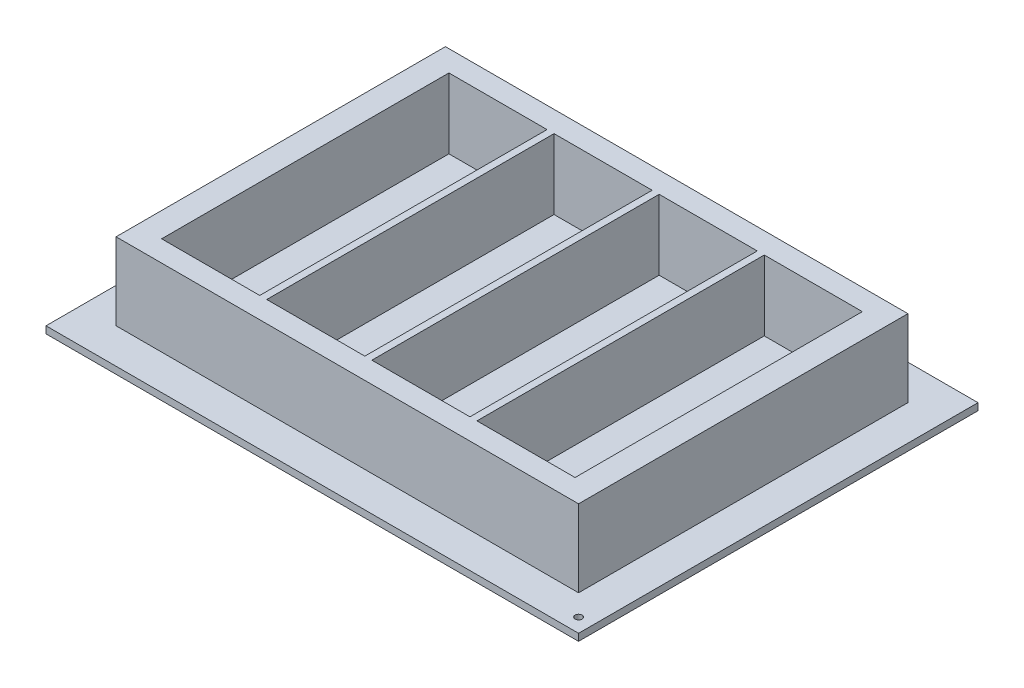
ISO-10303-21;
HEADER;
FILE_DESCRIPTION(('STEP AP214'),'2;1');
FILE_NAME('part.step','',(''),(''),'','','');
FILE_SCHEMA(('AUTOMOTIVE_DESIGN { 1 0 10303 214 1 1 1 1 }'));
ENDSEC;
DATA;
#1=APPLICATION_CONTEXT('core data for automotive mechanical design processes');
#2=APPLICATION_PROTOCOL_DEFINITION('international standard','automotive_design',2000,#1);
#3=PRODUCT_CONTEXT('',#1,'mechanical');
#4=PRODUCT('Part','Part','',(#3));
#5=PRODUCT_RELATED_PRODUCT_CATEGORY('part','',(#4));
#6=PRODUCT_DEFINITION_FORMATION('','',#4);
#7=PRODUCT_DEFINITION_CONTEXT('part definition',#1,'design');
#8=PRODUCT_DEFINITION('design','',#6,#7);
#9=PRODUCT_DEFINITION_SHAPE('','',#8);
#10=(LENGTH_UNIT() NAMED_UNIT(*) SI_UNIT(.MILLI.,.METRE.));
#11=(NAMED_UNIT(*) PLANE_ANGLE_UNIT() SI_UNIT($,.RADIAN.));
#12=(NAMED_UNIT(*) SI_UNIT($,.STERADIAN.) SOLID_ANGLE_UNIT());
#13=UNCERTAINTY_MEASURE_WITH_UNIT(LENGTH_MEASURE(1.E-05),#10,'distance_accuracy_value','');
#14=(GEOMETRIC_REPRESENTATION_CONTEXT(3) GLOBAL_UNCERTAINTY_ASSIGNED_CONTEXT((#13)) GLOBAL_UNIT_ASSIGNED_CONTEXT((#10,
#11,#12)) REPRESENTATION_CONTEXT('',''));
#15=CARTESIAN_POINT('',(0.,0.,0.));
#16=DIRECTION('',(0.,0.,1.));
#17=DIRECTION('',(1.,0.,0.));
#18=AXIS2_PLACEMENT_3D('',#15,#16,#17);
#19=CARTESIAN_POINT('',(-29.5,10.,-20.5));
#20=DIRECTION('',(0.,0.,1.));
#21=DIRECTION('',(1.,0.,0.));
#22=AXIS2_PLACEMENT_3D('',#19,#20,#21);
#23=PLANE('',#22);
#24=DIRECTION('',(-1.,0.,0.));
#25=VECTOR('',#24,1.);
#26=CARTESIAN_POINT('',(-29.5,10.,-20.5));
#27=LINE('',#26,#25);
#28=CARTESIAN_POINT('',(29.5,10.,-20.5));
#29=VERTEX_POINT('',#28);
#30=CARTESIAN_POINT('',(15.5,10.,-20.5));
#31=VERTEX_POINT('',#30);
#32=EDGE_CURVE('E311',#29,#31,#27,.T.);
#33=ORIENTED_EDGE('',*,*,#32,.T.);
#34=DIRECTION('',(0.,1.,0.));
#35=VECTOR('',#34,1.);
#36=CARTESIAN_POINT('',(15.5,0.,-20.5));
#37=LINE('',#36,#35);
#38=CARTESIAN_POINT('',(15.5,0.,-20.5));
#39=VERTEX_POINT('',#38);
#40=EDGE_CURVE('E64',#39,#31,#37,.T.);
#41=ORIENTED_EDGE('',*,*,#40,.F.);
#42=DIRECTION('',(-1.,0.,0.));
#43=VECTOR('',#42,1.);
#44=CARTESIAN_POINT('',(-29.5,0.,-20.5));
#45=LINE('',#44,#43);
#46=CARTESIAN_POINT('',(29.5,0.,-20.5));
#47=VERTEX_POINT('',#46);
#48=EDGE_CURVE('E326',#47,#39,#45,.T.);
#49=ORIENTED_EDGE('',*,*,#48,.F.);
#50=DIRECTION('',(0.,-1.,0.));
#51=VECTOR('',#50,1.);
#52=CARTESIAN_POINT('',(29.5,10.,-20.5));
#53=LINE('',#52,#51);
#54=EDGE_CURVE('E343',#29,#47,#53,.T.);
#55=ORIENTED_EDGE('',*,*,#54,.F.);
#56=EDGE_LOOP('',(#33,#41,#49,#55));
#57=FACE_BOUND('',#56,.T.);
#58=ADVANCED_FACE('F41',(#57),#23,.T.);
#59=CARTESIAN_POINT('',(-29.5,10.,20.5));
#60=DIRECTION('',(0.,0.,-1.));
#61=DIRECTION('',(-1.,0.,0.));
#62=AXIS2_PLACEMENT_3D('',#59,#60,#61);
#63=PLANE('',#62);
#64=DIRECTION('',(1.,0.,0.));
#65=VECTOR('',#64,1.);
#66=CARTESIAN_POINT('',(-29.5,0.,20.5));
#67=LINE('',#66,#65);
#68=CARTESIAN_POINT('',(15.5,0.,20.5));
#69=VERTEX_POINT('',#68);
#70=CARTESIAN_POINT('',(29.5,0.,20.5));
#71=VERTEX_POINT('',#70);
#72=EDGE_CURVE('E332',#69,#71,#67,.T.);
#73=ORIENTED_EDGE('',*,*,#72,.F.);
#74=DIRECTION('',(0.,1.,0.));
#75=VECTOR('',#74,1.);
#76=CARTESIAN_POINT('',(15.5,0.,20.5));
#77=LINE('',#76,#75);
#78=CARTESIAN_POINT('',(15.5,10.,20.5));
#79=VERTEX_POINT('',#78);
#80=EDGE_CURVE('E242',#69,#79,#77,.T.);
#81=ORIENTED_EDGE('',*,*,#80,.T.);
#82=DIRECTION('',(1.,0.,0.));
#83=VECTOR('',#82,1.);
#84=CARTESIAN_POINT('',(-29.5,10.,20.5));
#85=LINE('',#84,#83);
#86=CARTESIAN_POINT('',(29.5,10.,20.5));
#87=VERTEX_POINT('',#86);
#88=EDGE_CURVE('E317',#79,#87,#85,.T.);
#89=ORIENTED_EDGE('',*,*,#88,.T.);
#90=DIRECTION('',(0.,-1.,0.));
#91=VECTOR('',#90,1.);
#92=CARTESIAN_POINT('',(29.5,10.,20.5));
#93=LINE('',#92,#91);
#94=EDGE_CURVE('E321',#87,#71,#93,.T.);
#95=ORIENTED_EDGE('',*,*,#94,.T.);
#96=EDGE_LOOP('',(#73,#81,#89,#95));
#97=FACE_BOUND('',#96,.T.);
#98=ADVANCED_FACE('F390',(#97),#63,.T.);
#99=CARTESIAN_POINT('',(0.,0.,0.));
#100=DIRECTION('',(0.,-1.,0.));
#101=DIRECTION('',(0.,0.,-1.));
#102=AXIS2_PLACEMENT_3D('',#99,#100,#101);
#103=PLANE('',#102);
#104=DIRECTION('',(0.,0.,1.));
#105=VECTOR('',#104,1.);
#106=CARTESIAN_POINT('',(15.5,0.,0.));
#107=LINE('',#106,#105);
#108=EDGE_CURVE('E237',#39,#69,#107,.T.);
#109=ORIENTED_EDGE('',*,*,#108,.T.);
#110=ORIENTED_EDGE('',*,*,#72,.T.);
#111=DIRECTION('',(0.,0.,-1.));
#112=VECTOR('',#111,1.);
#113=CARTESIAN_POINT('',(29.5,0.,-20.5));
#114=LINE('',#113,#112);
#115=EDGE_CURVE('E306',#71,#47,#114,.T.);
#116=ORIENTED_EDGE('',*,*,#115,.T.);
#117=ORIENTED_EDGE('',*,*,#48,.T.);
#118=EDGE_LOOP('',(#109,#110,#116,#117));
#119=FACE_BOUND('',#118,.T.);
#120=ADVANCED_FACE('F397',(#119),#103,.F.);
#121=DIRECTION('',(0.,1.,0.));
#122=VECTOR('',#121,1.);
#123=CARTESIAN_POINT('',(14.5,0.,-20.5));
#124=LINE('',#123,#122);
#125=CARTESIAN_POINT('',(14.5,0.,-20.5));
#126=VERTEX_POINT('',#125);
#127=CARTESIAN_POINT('',(14.5,10.,-20.5));
#128=VERTEX_POINT('',#127);
#129=EDGE_CURVE('E248',#126,#128,#124,.T.);
#130=ORIENTED_EDGE('',*,*,#129,.T.);
#131=CARTESIAN_POINT('',(0.499999999999994,10.,-20.5));
#132=VERTEX_POINT('',#131);
#133=EDGE_CURVE('E314',#128,#132,#27,.T.);
#134=ORIENTED_EDGE('',*,*,#133,.T.);
#135=DIRECTION('',(0.,1.,0.));
#136=VECTOR('',#135,1.);
#137=CARTESIAN_POINT('',(0.499999999999998,0.,-20.5));
#138=LINE('',#137,#136);
#139=CARTESIAN_POINT('',(0.499999999999994,0.,-20.5));
#140=VERTEX_POINT('',#139);
#141=EDGE_CURVE('E263',#140,#132,#138,.T.);
#142=ORIENTED_EDGE('',*,*,#141,.F.);
#143=EDGE_CURVE('E329',#126,#140,#45,.T.);
#144=ORIENTED_EDGE('',*,*,#143,.F.);
#145=EDGE_LOOP('',(#130,#134,#142,#144));
#146=FACE_BOUND('',#145,.T.);
#147=ADVANCED_FACE('F392',(#146),#23,.T.);
#148=DIRECTION('',(0.,1.,0.));
#149=VECTOR('',#148,1.);
#150=CARTESIAN_POINT('',(14.5,0.,20.5));
#151=LINE('',#150,#149);
#152=CARTESIAN_POINT('',(14.5,0.,20.5));
#153=VERTEX_POINT('',#152);
#154=CARTESIAN_POINT('',(14.5,10.,20.5));
#155=VERTEX_POINT('',#154);
#156=EDGE_CURVE('E245',#153,#155,#151,.T.);
#157=ORIENTED_EDGE('',*,*,#156,.F.);
#158=CARTESIAN_POINT('',(0.499999999999997,0.,20.5));
#159=VERTEX_POINT('',#158);
#160=EDGE_CURVE('E443',#159,#153,#67,.T.);
#161=ORIENTED_EDGE('',*,*,#160,.F.);
#162=DIRECTION('',(0.,1.,0.));
#163=VECTOR('',#162,1.);
#164=CARTESIAN_POINT('',(0.500000000000003,0.,20.5));
#165=LINE('',#164,#163);
#166=CARTESIAN_POINT('',(0.500000000000003,10.,20.5));
#167=VERTEX_POINT('',#166);
#168=EDGE_CURVE('E267',#159,#167,#165,.T.);
#169=ORIENTED_EDGE('',*,*,#168,.T.);
#170=EDGE_CURVE('E504',#167,#155,#85,.T.);
#171=ORIENTED_EDGE('',*,*,#170,.T.);
#172=EDGE_LOOP('',(#157,#161,#169,#171));
#173=FACE_BOUND('',#172,.T.);
#174=ADVANCED_FACE('F400',(#173),#63,.T.);
#175=ORIENTED_EDGE('',*,*,#160,.T.);
#176=DIRECTION('',(0.,0.,1.));
#177=VECTOR('',#176,1.);
#178=CARTESIAN_POINT('',(14.5,0.,0.));
#179=LINE('',#178,#177);
#180=EDGE_CURVE('E56',#126,#153,#179,.T.);
#181=ORIENTED_EDGE('',*,*,#180,.F.);
#182=ORIENTED_EDGE('',*,*,#143,.T.);
#183=DIRECTION('',(0.,0.,1.));
#184=VECTOR('',#183,1.);
#185=CARTESIAN_POINT('',(0.5,0.,0.));
#186=LINE('',#185,#184);
#187=EDGE_CURVE('E255',#140,#159,#186,.T.);
#188=ORIENTED_EDGE('',*,*,#187,.T.);
#189=EDGE_LOOP('',(#175,#181,#182,#188));
#190=FACE_BOUND('',#189,.T.);
#191=ADVANCED_FACE('F419',(#190),#103,.F.);
#192=DIRECTION('',(0.,1.,0.));
#193=VECTOR('',#192,1.);
#194=CARTESIAN_POINT('',(-0.500000000000002,0.,-20.5));
#195=LINE('',#194,#193);
#196=CARTESIAN_POINT('',(-0.500000000000007,0.,-20.5));
#197=VERTEX_POINT('',#196);
#198=CARTESIAN_POINT('',(-0.500000000000007,10.,-20.5));
#199=VERTEX_POINT('',#198);
#200=EDGE_CURVE('E258',#197,#199,#195,.T.);
#201=ORIENTED_EDGE('',*,*,#200,.T.);
#202=CARTESIAN_POINT('',(-14.5,10.,-20.5));
#203=VERTEX_POINT('',#202);
#204=EDGE_CURVE('E431',#199,#203,#27,.T.);
#205=ORIENTED_EDGE('',*,*,#204,.T.);
#206=DIRECTION('',(0.,1.,0.));
#207=VECTOR('',#206,1.);
#208=CARTESIAN_POINT('',(-14.5,0.,-20.5));
#209=LINE('',#208,#207);
#210=CARTESIAN_POINT('',(-14.5,0.,-20.5));
#211=VERTEX_POINT('',#210);
#212=EDGE_CURVE('E280',#211,#203,#209,.T.);
#213=ORIENTED_EDGE('',*,*,#212,.F.);
#214=EDGE_CURVE('E432',#197,#211,#45,.T.);
#215=ORIENTED_EDGE('',*,*,#214,.F.);
#216=EDGE_LOOP('',(#201,#205,#213,#215));
#217=FACE_BOUND('',#216,.T.);
#218=ADVANCED_FACE('F406',(#217),#23,.T.);
#219=DIRECTION('',(0.,1.,0.));
#220=VECTOR('',#219,1.);
#221=CARTESIAN_POINT('',(-0.5,0.,20.5));
#222=LINE('',#221,#220);
#223=CARTESIAN_POINT('',(-0.500000000000007,0.,20.5));
#224=VERTEX_POINT('',#223);
#225=CARTESIAN_POINT('',(-0.500000000000007,10.,20.5));
#226=VERTEX_POINT('',#225);
#227=EDGE_CURVE('E270',#224,#226,#222,.T.);
#228=ORIENTED_EDGE('',*,*,#227,.F.);
#229=CARTESIAN_POINT('',(-14.5,0.,20.5));
#230=VERTEX_POINT('',#229);
#231=EDGE_CURVE('E335',#230,#224,#67,.T.);
#232=ORIENTED_EDGE('',*,*,#231,.F.);
#233=DIRECTION('',(0.,1.,0.));
#234=VECTOR('',#233,1.);
#235=CARTESIAN_POINT('',(-14.5,0.,20.5));
#236=LINE('',#235,#234);
#237=CARTESIAN_POINT('',(-14.5,10.,20.5));
#238=VERTEX_POINT('',#237);
#239=EDGE_CURVE('E284',#230,#238,#236,.T.);
#240=ORIENTED_EDGE('',*,*,#239,.T.);
#241=EDGE_CURVE('E322',#238,#226,#85,.T.);
#242=ORIENTED_EDGE('',*,*,#241,.T.);
#243=EDGE_LOOP('',(#228,#232,#240,#242));
#244=FACE_BOUND('',#243,.T.);
#245=ADVANCED_FACE('F418',(#244),#63,.T.);
#246=ORIENTED_EDGE('',*,*,#231,.T.);
#247=DIRECTION('',(0.,0.,1.));
#248=VECTOR('',#247,1.);
#249=CARTESIAN_POINT('',(-0.5,0.,0.));
#250=LINE('',#249,#248);
#251=EDGE_CURVE('E252',#197,#224,#250,.T.);
#252=ORIENTED_EDGE('',*,*,#251,.F.);
#253=ORIENTED_EDGE('',*,*,#214,.T.);
#254=DIRECTION('',(0.,0.,1.));
#255=VECTOR('',#254,1.);
#256=CARTESIAN_POINT('',(-14.5,0.,0.));
#257=LINE('',#256,#255);
#258=EDGE_CURVE('E274',#211,#230,#257,.T.);
#259=ORIENTED_EDGE('',*,*,#258,.T.);
#260=EDGE_LOOP('',(#246,#252,#253,#259));
#261=FACE_BOUND('',#260,.T.);
#262=ADVANCED_FACE('F386',(#261),#103,.F.);
#263=CARTESIAN_POINT('',(0.,10.,0.));
#264=DIRECTION('',(0.,1.,0.));
#265=DIRECTION('',(0.,0.,1.));
#266=AXIS2_PLACEMENT_3D('',#263,#264,#265);
#267=PLANE('',#266);
#268=DIRECTION('',(0.,0.,1.));
#269=VECTOR('',#268,1.);
#270=CARTESIAN_POINT('',(14.5,10.,0.));
#271=LINE('',#270,#269);
#272=EDGE_CURVE('E231',#128,#155,#271,.T.);
#273=ORIENTED_EDGE('',*,*,#272,.T.);
#274=ORIENTED_EDGE('',*,*,#170,.F.);
#275=DIRECTION('',(0.,0.,1.));
#276=VECTOR('',#275,1.);
#277=CARTESIAN_POINT('',(0.5,10.,0.));
#278=LINE('',#277,#276);
#279=EDGE_CURVE('E256',#132,#167,#278,.T.);
#280=ORIENTED_EDGE('',*,*,#279,.F.);
#281=ORIENTED_EDGE('',*,*,#133,.F.);
#282=EDGE_LOOP('',(#273,#274,#280,#281));
#283=FACE_BOUND('',#282,.T.);
#284=ORIENTED_EDGE('',*,*,#88,.F.);
#285=DIRECTION('',(0.,0.,1.));
#286=VECTOR('',#285,1.);
#287=CARTESIAN_POINT('',(15.5,10.,0.));
#288=LINE('',#287,#286);
#289=EDGE_CURVE('E228',#31,#79,#288,.T.);
#290=ORIENTED_EDGE('',*,*,#289,.F.);
#291=ORIENTED_EDGE('',*,*,#32,.F.);
#292=DIRECTION('',(0.,0.,-1.));
#293=VECTOR('',#292,1.);
#294=CARTESIAN_POINT('',(29.5,10.,-20.5));
#295=LINE('',#294,#293);
#296=EDGE_CURVE('E307',#87,#29,#295,.T.);
#297=ORIENTED_EDGE('',*,*,#296,.F.);
#298=EDGE_LOOP('',(#284,#290,#291,#297));
#299=FACE_BOUND('',#298,.T.);
#300=DIRECTION('',(0.,0.,1.));
#301=VECTOR('',#300,1.);
#302=CARTESIAN_POINT('',(-14.5,10.,0.));
#303=LINE('',#302,#301);
#304=EDGE_CURVE('E266',#203,#238,#303,.T.);
#305=ORIENTED_EDGE('',*,*,#304,.F.);
#306=ORIENTED_EDGE('',*,*,#204,.F.);
#307=DIRECTION('',(0.,0.,1.));
#308=VECTOR('',#307,1.);
#309=CARTESIAN_POINT('',(-0.5,10.,0.));
#310=LINE('',#309,#308);
#311=EDGE_CURVE('E244',#199,#226,#310,.T.);
#312=ORIENTED_EDGE('',*,*,#311,.T.);
#313=ORIENTED_EDGE('',*,*,#241,.F.);
#314=EDGE_LOOP('',(#305,#306,#312,#313));
#315=FACE_BOUND('',#314,.T.);
#316=DIRECTION('',(0.,0.,-1.));
#317=VECTOR('',#316,1.);
#318=CARTESIAN_POINT('',(33.,10.,-23.5));
#319=LINE('',#318,#317);
#320=CARTESIAN_POINT('',(33.,10.,23.5));
#321=VERTEX_POINT('',#320);
#322=CARTESIAN_POINT('',(33.,10.,-23.5));
#323=VERTEX_POINT('',#322);
#324=EDGE_CURVE('E346',#321,#323,#319,.T.);
#325=ORIENTED_EDGE('',*,*,#324,.T.);
#326=DIRECTION('',(-1.,0.,0.));
#327=VECTOR('',#326,1.);
#328=CARTESIAN_POINT('',(-33.,10.,-23.5));
#329=LINE('',#328,#327);
#330=CARTESIAN_POINT('',(-33.,10.,-23.5));
#331=VERTEX_POINT('',#330);
#332=EDGE_CURVE('E349',#323,#331,#329,.T.);
#333=ORIENTED_EDGE('',*,*,#332,.T.);
#334=DIRECTION('',(0.,0.,1.));
#335=VECTOR('',#334,1.);
#336=CARTESIAN_POINT('',(-33.,10.,-23.5));
#337=LINE('',#336,#335);
#338=CARTESIAN_POINT('',(-33.,10.,23.5));
#339=VERTEX_POINT('',#338);
#340=EDGE_CURVE('E351',#331,#339,#337,.T.);
#341=ORIENTED_EDGE('',*,*,#340,.T.);
#342=DIRECTION('',(1.,0.,0.));
#343=VECTOR('',#342,1.);
#344=CARTESIAN_POINT('',(-33.,10.,23.5));
#345=LINE('',#344,#343);
#346=EDGE_CURVE('E353',#339,#321,#345,.T.);
#347=ORIENTED_EDGE('',*,*,#346,.T.);
#348=EDGE_LOOP('',(#325,#333,#341,#347));
#349=FACE_BOUND('',#348,.T.);
#350=CARTESIAN_POINT('',(-15.5,10.,-20.5));
#351=VERTEX_POINT('',#350);
#352=CARTESIAN_POINT('',(-29.5,10.,-20.5));
#353=VERTEX_POINT('',#352);
#354=EDGE_CURVE('E309',#351,#353,#27,.T.);
#355=ORIENTED_EDGE('',*,*,#354,.F.);
#356=DIRECTION('',(0.,0.,1.));
#357=VECTOR('',#356,1.);
#358=CARTESIAN_POINT('',(-15.5,10.,0.));
#359=LINE('',#358,#357);
#360=CARTESIAN_POINT('',(-15.5,10.,20.5));
#361=VERTEX_POINT('',#360);
#362=EDGE_CURVE('E278',#351,#361,#359,.T.);
#363=ORIENTED_EDGE('',*,*,#362,.T.);
#364=CARTESIAN_POINT('',(-29.5,10.,20.5));
#365=VERTEX_POINT('',#364);
#366=EDGE_CURVE('E318',#365,#361,#85,.T.);
#367=ORIENTED_EDGE('',*,*,#366,.F.);
#368=DIRECTION('',(0.,0.,1.));
#369=VECTOR('',#368,1.);
#370=CARTESIAN_POINT('',(-29.5,10.,-20.5));
#371=LINE('',#370,#369);
#372=EDGE_CURVE('E313',#353,#365,#371,.T.);
#373=ORIENTED_EDGE('',*,*,#372,.F.);
#374=EDGE_LOOP('',(#355,#363,#367,#373));
#375=FACE_BOUND('',#374,.T.);
#376=ADVANCED_FACE('F377',(#283,#299,#315,#349,#375),#267,.T.);
#377=CARTESIAN_POINT('',(33.,10.,-23.5));
#378=DIRECTION('',(-1.,0.,0.));
#379=DIRECTION('',(0.,0.,1.));
#380=AXIS2_PLACEMENT_3D('',#377,#378,#379);
#381=PLANE('',#380);
#382=DIRECTION('',(0.,-1.,0.));
#383=VECTOR('',#382,1.);
#384=CARTESIAN_POINT('',(33.,10.,23.5));
#385=LINE('',#384,#383);
#386=CARTESIAN_POINT('',(33.,-1.,23.5));
#387=VERTEX_POINT('',#386);
#388=EDGE_CURVE('E355',#321,#387,#385,.T.);
#389=ORIENTED_EDGE('',*,*,#388,.T.);
#390=DIRECTION('',(0.,0.,1.));
#391=VECTOR('',#390,1.);
#392=CARTESIAN_POINT('',(33.,-1.,23.5));
#393=LINE('',#392,#391);
#394=CARTESIAN_POINT('',(33.,-1.,-23.5));
#395=VERTEX_POINT('',#394);
#396=EDGE_CURVE('E287',#395,#387,#393,.T.);
#397=ORIENTED_EDGE('',*,*,#396,.F.);
#398=DIRECTION('',(0.,-1.,0.));
#399=VECTOR('',#398,1.);
#400=CARTESIAN_POINT('',(33.,10.,-23.5));
#401=LINE('',#400,#399);
#402=EDGE_CURVE('E11',#323,#395,#401,.T.);
#403=ORIENTED_EDGE('',*,*,#402,.F.);
#404=ORIENTED_EDGE('',*,*,#324,.F.);
#405=EDGE_LOOP('',(#389,#397,#403,#404));
#406=FACE_BOUND('',#405,.T.);
#407=ADVANCED_FACE('F43',(#406),#381,.F.);
#408=CARTESIAN_POINT('',(-33.,10.,-23.5));
#409=DIRECTION('',(0.,0.,1.));
#410=DIRECTION('',(1.,0.,0.));
#411=AXIS2_PLACEMENT_3D('',#408,#409,#410);
#412=PLANE('',#411);
#413=ORIENTED_EDGE('',*,*,#402,.T.);
#414=DIRECTION('',(1.,0.,0.));
#415=VECTOR('',#414,1.);
#416=CARTESIAN_POINT('',(-33.,-1.,-23.5));
#417=LINE('',#416,#415);
#418=CARTESIAN_POINT('',(-33.,-1.,-23.5));
#419=VERTEX_POINT('',#418);
#420=EDGE_CURVE('E303',#419,#395,#417,.T.);
#421=ORIENTED_EDGE('',*,*,#420,.F.);
#422=DIRECTION('',(0.,-1.,0.));
#423=VECTOR('',#422,1.);
#424=CARTESIAN_POINT('',(-33.,10.,-23.5));
#425=LINE('',#424,#423);
#426=EDGE_CURVE('E49',#331,#419,#425,.T.);
#427=ORIENTED_EDGE('',*,*,#426,.F.);
#428=ORIENTED_EDGE('',*,*,#332,.F.);
#429=EDGE_LOOP('',(#413,#421,#427,#428));
#430=FACE_BOUND('',#429,.T.);
#431=ADVANCED_FACE('F366',(#430),#412,.F.);
#432=CARTESIAN_POINT('',(-33.,10.,-23.5));
#433=DIRECTION('',(1.,0.,0.));
#434=DIRECTION('',(0.,0.,-1.));
#435=AXIS2_PLACEMENT_3D('',#432,#433,#434);
#436=PLANE('',#435);
#437=ORIENTED_EDGE('',*,*,#426,.T.);
#438=DIRECTION('',(0.,0.,-1.));
#439=VECTOR('',#438,1.);
#440=CARTESIAN_POINT('',(-33.,-1.,23.5));
#441=LINE('',#440,#439);
#442=CARTESIAN_POINT('',(-33.,-1.,23.5));
#443=VERTEX_POINT('',#442);
#444=EDGE_CURVE('E300',#443,#419,#441,.T.);
#445=ORIENTED_EDGE('',*,*,#444,.F.);
#446=DIRECTION('',(0.,-1.,0.));
#447=VECTOR('',#446,1.);
#448=CARTESIAN_POINT('',(-33.,10.,23.5));
#449=LINE('',#448,#447);
#450=EDGE_CURVE('E357',#339,#443,#449,.T.);
#451=ORIENTED_EDGE('',*,*,#450,.F.);
#452=ORIENTED_EDGE('',*,*,#340,.F.);
#453=EDGE_LOOP('',(#437,#445,#451,#452));
#454=FACE_BOUND('',#453,.T.);
#455=ADVANCED_FACE('F363',(#454),#436,.F.);
#456=CARTESIAN_POINT('',(-33.,10.,23.5));
#457=DIRECTION('',(0.,0.,-1.));
#458=DIRECTION('',(-1.,0.,0.));
#459=AXIS2_PLACEMENT_3D('',#456,#457,#458);
#460=PLANE('',#459);
#461=ORIENTED_EDGE('',*,*,#450,.T.);
#462=DIRECTION('',(-1.,0.,0.));
#463=VECTOR('',#462,1.);
#464=CARTESIAN_POINT('',(-33.,-1.,23.5));
#465=LINE('',#464,#463);
#466=EDGE_CURVE('E297',#387,#443,#465,.T.);
#467=ORIENTED_EDGE('',*,*,#466,.F.);
#468=ORIENTED_EDGE('',*,*,#388,.F.);
#469=ORIENTED_EDGE('',*,*,#346,.F.);
#470=EDGE_LOOP('',(#461,#467,#468,#469));
#471=FACE_BOUND('',#470,.T.);
#472=ADVANCED_FACE('F373',(#471),#460,.F.);
#473=CARTESIAN_POINT('',(29.5,10.,-20.5));
#474=DIRECTION('',(-1.,0.,0.));
#475=DIRECTION('',(0.,0.,1.));
#476=AXIS2_PLACEMENT_3D('',#473,#474,#475);
#477=PLANE('',#476);
#478=ORIENTED_EDGE('',*,*,#115,.F.);
#479=ORIENTED_EDGE('',*,*,#94,.F.);
#480=ORIENTED_EDGE('',*,*,#296,.T.);
#481=ORIENTED_EDGE('',*,*,#54,.T.);
#482=EDGE_LOOP('',(#478,#479,#480,#481));
#483=FACE_BOUND('',#482,.T.);
#484=ADVANCED_FACE('F409',(#483),#477,.T.);
#485=DIRECTION('',(0.,1.,0.));
#486=VECTOR('',#485,1.);
#487=CARTESIAN_POINT('',(-15.5,0.,-20.5));
#488=LINE('',#487,#486);
#489=CARTESIAN_POINT('',(-15.5,0.,-20.5));
#490=VERTEX_POINT('',#489);
#491=EDGE_CURVE('E290',#490,#351,#488,.T.);
#492=ORIENTED_EDGE('',*,*,#491,.T.);
#493=ORIENTED_EDGE('',*,*,#354,.T.);
#494=DIRECTION('',(0.,-1.,0.));
#495=VECTOR('',#494,1.);
#496=CARTESIAN_POINT('',(-29.5,10.,-20.5));
#497=LINE('',#496,#495);
#498=CARTESIAN_POINT('',(-29.5,0.,-20.5));
#499=VERTEX_POINT('',#498);
#500=EDGE_CURVE('E340',#353,#499,#497,.T.);
#501=ORIENTED_EDGE('',*,*,#500,.T.);
#502=EDGE_CURVE('E325',#490,#499,#45,.T.);
#503=ORIENTED_EDGE('',*,*,#502,.F.);
#504=EDGE_LOOP('',(#492,#493,#501,#503));
#505=FACE_BOUND('',#504,.T.);
#506=ADVANCED_FACE('F393',(#505),#23,.T.);
#507=CARTESIAN_POINT('',(-29.5,10.,-20.5));
#508=DIRECTION('',(1.,0.,0.));
#509=DIRECTION('',(0.,0.,-1.));
#510=AXIS2_PLACEMENT_3D('',#507,#508,#509);
#511=PLANE('',#510);
#512=DIRECTION('',(0.,0.,1.));
#513=VECTOR('',#512,1.);
#514=CARTESIAN_POINT('',(-29.5,0.,-20.5));
#515=LINE('',#514,#513);
#516=CARTESIAN_POINT('',(-29.5,0.,20.5));
#517=VERTEX_POINT('',#516);
#518=EDGE_CURVE('E328',#499,#517,#515,.T.);
#519=ORIENTED_EDGE('',*,*,#518,.F.);
#520=ORIENTED_EDGE('',*,*,#500,.F.);
#521=ORIENTED_EDGE('',*,*,#372,.T.);
#522=DIRECTION('',(0.,-1.,0.));
#523=VECTOR('',#522,1.);
#524=CARTESIAN_POINT('',(-29.5,10.,20.5));
#525=LINE('',#524,#523);
#526=EDGE_CURVE('E338',#365,#517,#525,.T.);
#527=ORIENTED_EDGE('',*,*,#526,.T.);
#528=EDGE_LOOP('',(#519,#520,#521,#527));
#529=FACE_BOUND('',#528,.T.);
#530=ADVANCED_FACE('F408',(#529),#511,.T.);
#531=DIRECTION('',(0.,1.,0.));
#532=VECTOR('',#531,1.);
#533=CARTESIAN_POINT('',(-15.5,0.,20.5));
#534=LINE('',#533,#532);
#535=CARTESIAN_POINT('',(-15.5,0.,20.5));
#536=VERTEX_POINT('',#535);
#537=EDGE_CURVE('E288',#536,#361,#534,.T.);
#538=ORIENTED_EDGE('',*,*,#537,.F.);
#539=EDGE_CURVE('E310',#517,#536,#67,.T.);
#540=ORIENTED_EDGE('',*,*,#539,.F.);
#541=ORIENTED_EDGE('',*,*,#526,.F.);
#542=ORIENTED_EDGE('',*,*,#366,.T.);
#543=EDGE_LOOP('',(#538,#540,#541,#542));
#544=FACE_BOUND('',#543,.T.);
#545=ADVANCED_FACE('F401',(#544),#63,.T.);
#546=ORIENTED_EDGE('',*,*,#539,.T.);
#547=DIRECTION('',(0.,0.,1.));
#548=VECTOR('',#547,1.);
#549=CARTESIAN_POINT('',(-15.5,0.,0.));
#550=LINE('',#549,#548);
#551=EDGE_CURVE('E277',#490,#536,#550,.T.);
#552=ORIENTED_EDGE('',*,*,#551,.F.);
#553=ORIENTED_EDGE('',*,*,#502,.T.);
#554=ORIENTED_EDGE('',*,*,#518,.T.);
#555=EDGE_LOOP('',(#546,#552,#553,#554));
#556=FACE_BOUND('',#555,.T.);
#557=ADVANCED_FACE('F481',(#556),#103,.F.);
#558=CARTESIAN_POINT('',(-14.5,0.,0.));
#559=DIRECTION('',(-1.,0.,0.));
#560=DIRECTION('',(0.,0.,1.));
#561=AXIS2_PLACEMENT_3D('',#558,#559,#560);
#562=PLANE('',#561);
#563=ORIENTED_EDGE('',*,*,#304,.T.);
#564=ORIENTED_EDGE('',*,*,#239,.F.);
#565=ORIENTED_EDGE('',*,*,#258,.F.);
#566=ORIENTED_EDGE('',*,*,#212,.T.);
#567=EDGE_LOOP('',(#563,#564,#565,#566));
#568=FACE_BOUND('',#567,.T.);
#569=ADVANCED_FACE('F478',(#568),#562,.F.);
#570=CARTESIAN_POINT('',(-15.5,0.,0.));
#571=DIRECTION('',(-1.,0.,0.));
#572=DIRECTION('',(0.,0.,1.));
#573=AXIS2_PLACEMENT_3D('',#570,#571,#572);
#574=PLANE('',#573);
#575=ORIENTED_EDGE('',*,*,#362,.F.);
#576=ORIENTED_EDGE('',*,*,#491,.F.);
#577=ORIENTED_EDGE('',*,*,#551,.T.);
#578=ORIENTED_EDGE('',*,*,#537,.T.);
#579=EDGE_LOOP('',(#575,#576,#577,#578));
#580=FACE_BOUND('',#579,.T.);
#581=ADVANCED_FACE('F473',(#580),#574,.T.);
#582=CARTESIAN_POINT('',(0.5,0.,0.));
#583=DIRECTION('',(-1.,0.,0.));
#584=DIRECTION('',(0.,0.,1.));
#585=AXIS2_PLACEMENT_3D('',#582,#583,#584);
#586=PLANE('',#585);
#587=ORIENTED_EDGE('',*,*,#279,.T.);
#588=ORIENTED_EDGE('',*,*,#168,.F.);
#589=ORIENTED_EDGE('',*,*,#187,.F.);
#590=ORIENTED_EDGE('',*,*,#141,.T.);
#591=EDGE_LOOP('',(#587,#588,#589,#590));
#592=FACE_BOUND('',#591,.T.);
#593=ADVANCED_FACE('F468',(#592),#586,.F.);
#594=CARTESIAN_POINT('',(-0.5,0.,0.));
#595=DIRECTION('',(-1.,0.,0.));
#596=DIRECTION('',(0.,0.,1.));
#597=AXIS2_PLACEMENT_3D('',#594,#595,#596);
#598=PLANE('',#597);
#599=ORIENTED_EDGE('',*,*,#311,.F.);
#600=ORIENTED_EDGE('',*,*,#200,.F.);
#601=ORIENTED_EDGE('',*,*,#251,.T.);
#602=ORIENTED_EDGE('',*,*,#227,.T.);
#603=EDGE_LOOP('',(#599,#600,#601,#602));
#604=FACE_BOUND('',#603,.T.);
#605=ADVANCED_FACE('F438',(#604),#598,.T.);
#606=CARTESIAN_POINT('',(15.5,0.,0.));
#607=DIRECTION('',(-1.,0.,0.));
#608=DIRECTION('',(0.,0.,1.));
#609=AXIS2_PLACEMENT_3D('',#606,#607,#608);
#610=PLANE('',#609);
#611=ORIENTED_EDGE('',*,*,#289,.T.);
#612=ORIENTED_EDGE('',*,*,#80,.F.);
#613=ORIENTED_EDGE('',*,*,#108,.F.);
#614=ORIENTED_EDGE('',*,*,#40,.T.);
#615=EDGE_LOOP('',(#611,#612,#613,#614));
#616=FACE_BOUND('',#615,.T.);
#617=ADVANCED_FACE('F458',(#616),#610,.F.);
#618=CARTESIAN_POINT('',(14.5,0.,0.));
#619=DIRECTION('',(-1.,0.,0.));
#620=DIRECTION('',(0.,0.,1.));
#621=AXIS2_PLACEMENT_3D('',#618,#619,#620);
#622=PLANE('',#621);
#623=ORIENTED_EDGE('',*,*,#272,.F.);
#624=ORIENTED_EDGE('',*,*,#129,.F.);
#625=ORIENTED_EDGE('',*,*,#180,.T.);
#626=ORIENTED_EDGE('',*,*,#156,.T.);
#627=EDGE_LOOP('',(#623,#624,#625,#626));
#628=FACE_BOUND('',#627,.T.);
#629=ADVANCED_FACE('F460',(#628),#622,.T.);
#630=CARTESIAN_POINT('',(0.,-1.,0.));
#631=DIRECTION('',(0.,-1.,0.));
#632=DIRECTION('',(0.,0.,-1.));
#633=AXIS2_PLACEMENT_3D('',#630,#631,#632);
#634=PLANE('',#633);
#635=CARTESIAN_POINT('',(-36.,-1.,-26.5));
#636=DIRECTION('',(0.,1.,0.));
#637=DIRECTION('',(0.,0.,1.));
#638=AXIS2_PLACEMENT_3D('',#635,#636,#637);
#639=CIRCLE('',#638,0.499999999999999);
#640=CARTESIAN_POINT('',(-36.,-1.,-26.));
#641=VERTEX_POINT('',#640);
#642=EDGE_CURVE('E829',#641,#641,#639,.T.);
#643=ORIENTED_EDGE('',*,*,#642,.F.);
#644=EDGE_LOOP('',(#643));
#645=FACE_BOUND('',#644,.T.);
#646=CARTESIAN_POINT('',(36.,-1.,26.5));
#647=DIRECTION('',(0.,1.,0.));
#648=DIRECTION('',(0.,0.,1.));
#649=AXIS2_PLACEMENT_3D('',#646,#647,#648);
#650=CIRCLE('',#649,0.499999999999999);
#651=CARTESIAN_POINT('',(36.,-1.,27.));
#652=VERTEX_POINT('',#651);
#653=EDGE_CURVE('E830',#652,#652,#650,.T.);
#654=ORIENTED_EDGE('',*,*,#653,.F.);
#655=EDGE_LOOP('',(#654));
#656=FACE_BOUND('',#655,.T.);
#657=DIRECTION('',(0.,0.,1.));
#658=VECTOR('',#657,1.);
#659=CARTESIAN_POINT('',(38.,-1.,28.5));
#660=LINE('',#659,#658);
#661=CARTESIAN_POINT('',(38.,-1.,-28.5));
#662=VERTEX_POINT('',#661);
#663=CARTESIAN_POINT('',(38.,-1.,28.5));
#664=VERTEX_POINT('',#663);
#665=EDGE_CURVE('E227',#662,#664,#660,.T.);
#666=ORIENTED_EDGE('',*,*,#665,.F.);
#667=DIRECTION('',(1.,0.,0.));
#668=VECTOR('',#667,1.);
#669=CARTESIAN_POINT('',(-38.,-1.,-28.5));
#670=LINE('',#669,#668);
#671=CARTESIAN_POINT('',(-38.,-1.,-28.5));
#672=VERTEX_POINT('',#671);
#673=EDGE_CURVE('E223',#672,#662,#670,.T.);
#674=ORIENTED_EDGE('',*,*,#673,.F.);
#675=DIRECTION('',(0.,0.,-1.));
#676=VECTOR('',#675,1.);
#677=CARTESIAN_POINT('',(-38.,-1.,28.5));
#678=LINE('',#677,#676);
#679=CARTESIAN_POINT('',(-38.,-1.,28.5));
#680=VERTEX_POINT('',#679);
#681=EDGE_CURVE('E845',#680,#672,#678,.T.);
#682=ORIENTED_EDGE('',*,*,#681,.F.);
#683=DIRECTION('',(-1.,0.,0.));
#684=VECTOR('',#683,1.);
#685=CARTESIAN_POINT('',(-38.,-1.,28.5));
#686=LINE('',#685,#684);
#687=EDGE_CURVE('E843',#664,#680,#686,.T.);
#688=ORIENTED_EDGE('',*,*,#687,.F.);
#689=EDGE_LOOP('',(#666,#674,#682,#688));
#690=FACE_BOUND('',#689,.T.);
#691=ORIENTED_EDGE('',*,*,#420,.T.);
#692=ORIENTED_EDGE('',*,*,#396,.T.);
#693=ORIENTED_EDGE('',*,*,#466,.T.);
#694=ORIENTED_EDGE('',*,*,#444,.T.);
#695=EDGE_LOOP('',(#691,#692,#693,#694));
#696=FACE_BOUND('',#695,.T.);
#697=ADVANCED_FACE('F369',(#645,#656,#690,#696),#634,.F.);
#698=CARTESIAN_POINT('',(38.,-2.,28.5));
#699=DIRECTION('',(-1.,0.,0.));
#700=DIRECTION('',(0.,0.,1.));
#701=AXIS2_PLACEMENT_3D('',#698,#699,#700);
#702=PLANE('',#701);
#703=ORIENTED_EDGE('',*,*,#665,.T.);
#704=DIRECTION('',(0.,1.,0.));
#705=VECTOR('',#704,1.);
#706=CARTESIAN_POINT('',(38.,-2.,28.5));
#707=LINE('',#706,#705);
#708=CARTESIAN_POINT('',(38.,-2.,28.5));
#709=VERTEX_POINT('',#708);
#710=EDGE_CURVE('E207',#709,#664,#707,.T.);
#711=ORIENTED_EDGE('',*,*,#710,.F.);
#712=DIRECTION('',(0.,0.,1.));
#713=VECTOR('',#712,1.);
#714=CARTESIAN_POINT('',(38.,-2.,28.5));
#715=LINE('',#714,#713);
#716=CARTESIAN_POINT('',(38.,-2.,-28.5));
#717=VERTEX_POINT('',#716);
#718=EDGE_CURVE('E214',#717,#709,#715,.T.);
#719=ORIENTED_EDGE('',*,*,#718,.F.);
#720=DIRECTION('',(0.,1.,0.));
#721=VECTOR('',#720,1.);
#722=CARTESIAN_POINT('',(38.,-2.,-28.5));
#723=LINE('',#722,#721);
#724=EDGE_CURVE('E841',#717,#662,#723,.T.);
#725=ORIENTED_EDGE('',*,*,#724,.T.);
#726=EDGE_LOOP('',(#703,#711,#719,#725));
#727=FACE_BOUND('',#726,.T.);
#728=ADVANCED_FACE('F225',(#727),#702,.F.);
#729=CARTESIAN_POINT('',(-38.,-2.,28.5));
#730=DIRECTION('',(0.,0.,-1.));
#731=DIRECTION('',(-1.,0.,0.));
#732=AXIS2_PLACEMENT_3D('',#729,#730,#731);
#733=PLANE('',#732);
#734=ORIENTED_EDGE('',*,*,#687,.T.);
#735=DIRECTION('',(0.,1.,0.));
#736=VECTOR('',#735,1.);
#737=CARTESIAN_POINT('',(-38.,-2.,28.5));
#738=LINE('',#737,#736);
#739=CARTESIAN_POINT('',(-38.,-2.,28.5));
#740=VERTEX_POINT('',#739);
#741=EDGE_CURVE('E210',#740,#680,#738,.T.);
#742=ORIENTED_EDGE('',*,*,#741,.F.);
#743=DIRECTION('',(-1.,0.,0.));
#744=VECTOR('',#743,1.);
#745=CARTESIAN_POINT('',(-38.,-2.,28.5));
#746=LINE('',#745,#744);
#747=EDGE_CURVE('E203',#709,#740,#746,.T.);
#748=ORIENTED_EDGE('',*,*,#747,.F.);
#749=ORIENTED_EDGE('',*,*,#710,.T.);
#750=EDGE_LOOP('',(#734,#742,#748,#749));
#751=FACE_BOUND('',#750,.T.);
#752=ADVANCED_FACE('F205',(#751),#733,.F.);
#753=CARTESIAN_POINT('',(-38.,-2.,28.5));
#754=DIRECTION('',(1.,0.,0.));
#755=DIRECTION('',(0.,0.,-1.));
#756=AXIS2_PLACEMENT_3D('',#753,#754,#755);
#757=PLANE('',#756);
#758=ORIENTED_EDGE('',*,*,#681,.T.);
#759=DIRECTION('',(0.,1.,0.));
#760=VECTOR('',#759,1.);
#761=CARTESIAN_POINT('',(-38.,-2.,-28.5));
#762=LINE('',#761,#760);
#763=CARTESIAN_POINT('',(-38.,-2.,-28.5));
#764=VERTEX_POINT('',#763);
#765=EDGE_CURVE('E233',#764,#672,#762,.T.);
#766=ORIENTED_EDGE('',*,*,#765,.F.);
#767=DIRECTION('',(0.,0.,-1.));
#768=VECTOR('',#767,1.);
#769=CARTESIAN_POINT('',(-38.,-2.,28.5));
#770=LINE('',#769,#768);
#771=EDGE_CURVE('E213',#740,#764,#770,.T.);
#772=ORIENTED_EDGE('',*,*,#771,.F.);
#773=ORIENTED_EDGE('',*,*,#741,.T.);
#774=EDGE_LOOP('',(#758,#766,#772,#773));
#775=FACE_BOUND('',#774,.T.);
#776=ADVANCED_FACE('F630',(#775),#757,.F.);
#777=CARTESIAN_POINT('',(-38.,-2.,-28.5));
#778=DIRECTION('',(0.,0.,1.));
#779=DIRECTION('',(1.,0.,0.));
#780=AXIS2_PLACEMENT_3D('',#777,#778,#779);
#781=PLANE('',#780);
#782=ORIENTED_EDGE('',*,*,#673,.T.);
#783=ORIENTED_EDGE('',*,*,#724,.F.);
#784=DIRECTION('',(1.,0.,0.));
#785=VECTOR('',#784,1.);
#786=CARTESIAN_POINT('',(-38.,-2.,-28.5));
#787=LINE('',#786,#785);
#788=EDGE_CURVE('E219',#764,#717,#787,.T.);
#789=ORIENTED_EDGE('',*,*,#788,.F.);
#790=ORIENTED_EDGE('',*,*,#765,.T.);
#791=EDGE_LOOP('',(#782,#783,#789,#790));
#792=FACE_BOUND('',#791,.T.);
#793=ADVANCED_FACE('F637',(#792),#781,.F.);
#794=CARTESIAN_POINT('',(0.,-2.,0.));
#795=DIRECTION('',(0.,-1.,0.));
#796=DIRECTION('',(0.,0.,-1.));
#797=AXIS2_PLACEMENT_3D('',#794,#795,#796);
#798=PLANE('',#797);
#799=CARTESIAN_POINT('',(-36.,-2.,-26.5));
#800=DIRECTION('',(0.,1.,0.));
#801=DIRECTION('',(0.,0.,1.));
#802=AXIS2_PLACEMENT_3D('',#799,#800,#801);
#803=CIRCLE('',#802,0.499999999999999);
#804=CARTESIAN_POINT('',(-36.,-2.,-26.));
#805=VERTEX_POINT('',#804);
#806=EDGE_CURVE('E826',#805,#805,#803,.T.);
#807=ORIENTED_EDGE('',*,*,#806,.T.);
#808=EDGE_LOOP('',(#807));
#809=FACE_BOUND('',#808,.T.);
#810=CARTESIAN_POINT('',(36.,-2.,26.5));
#811=DIRECTION('',(0.,1.,0.));
#812=DIRECTION('',(0.,0.,1.));
#813=AXIS2_PLACEMENT_3D('',#810,#811,#812);
#814=CIRCLE('',#813,0.499999999999999);
#815=CARTESIAN_POINT('',(36.,-2.,27.));
#816=VERTEX_POINT('',#815);
#817=EDGE_CURVE('E834',#816,#816,#814,.T.);
#818=ORIENTED_EDGE('',*,*,#817,.T.);
#819=EDGE_LOOP('',(#818));
#820=FACE_BOUND('',#819,.T.);
#821=ORIENTED_EDGE('',*,*,#718,.T.);
#822=ORIENTED_EDGE('',*,*,#747,.T.);
#823=ORIENTED_EDGE('',*,*,#771,.T.);
#824=ORIENTED_EDGE('',*,*,#788,.T.);
#825=EDGE_LOOP('',(#821,#822,#823,#824));
#826=FACE_BOUND('',#825,.T.);
#827=ADVANCED_FACE('F217',(#809,#820,#826),#798,.T.);
#828=CARTESIAN_POINT('',(36.,-2.,26.5));
#829=DIRECTION('',(0.,1.,0.));
#830=DIRECTION('',(0.,0.,1.));
#831=AXIS2_PLACEMENT_3D('',#828,#829,#830);
#832=CYLINDRICAL_SURFACE('',#831,0.499999999999999);
#833=ORIENTED_EDGE('',*,*,#817,.F.);
#834=EDGE_LOOP('',(#833));
#835=FACE_BOUND('',#834,.T.);
#836=ORIENTED_EDGE('',*,*,#653,.T.);
#837=EDGE_LOOP('',(#836));
#838=FACE_BOUND('',#837,.T.);
#839=ADVANCED_FACE('F650',(#835,#838),#832,.F.);
#840=CARTESIAN_POINT('',(-36.,-2.,-26.5));
#841=DIRECTION('',(0.,1.,0.));
#842=DIRECTION('',(0.,0.,1.));
#843=AXIS2_PLACEMENT_3D('',#840,#841,#842);
#844=CYLINDRICAL_SURFACE('',#843,0.499999999999999);
#845=ORIENTED_EDGE('',*,*,#806,.F.);
#846=EDGE_LOOP('',(#845));
#847=FACE_BOUND('',#846,.T.);
#848=ORIENTED_EDGE('',*,*,#642,.T.);
#849=EDGE_LOOP('',(#848));
#850=FACE_BOUND('',#849,.T.);
#851=ADVANCED_FACE('F658',(#847,#850),#844,.F.);
#852=CLOSED_SHELL('',(#58,#98,#120,#147,#174,#191,#218,#245,#262,#376,#407,#431,#455,#472,#484,
#506,#530,#545,#557,#569,#581,#593,#605,#617,#629,#697,#728,#752,#776,#793,#827,#839,#851));
#853=MANIFOLD_SOLID_BREP('B2',#852);
#854=ADVANCED_BREP_SHAPE_REPRESENTATION('',(#18,#853),#14);
#855=SHAPE_DEFINITION_REPRESENTATION(#9,#854);
ENDSEC;
END-ISO-10303-21;
